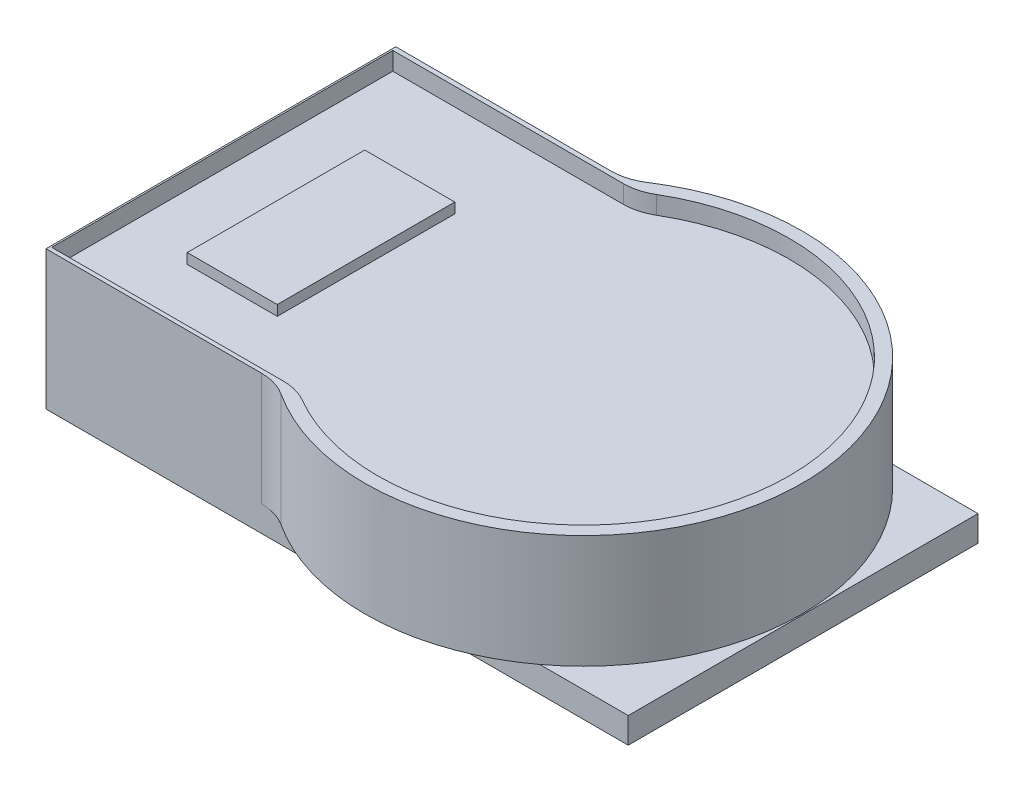
ISO-10303-21;
HEADER;
FILE_DESCRIPTION(('STEP AP214'),'2;1');
FILE_NAME('part.step','',(''),(''),'','','');
FILE_SCHEMA(('AUTOMOTIVE_DESIGN { 1 0 10303 214 1 1 1 1 }'));
ENDSEC;
DATA;
#1=APPLICATION_CONTEXT('core data for automotive mechanical design processes');
#2=APPLICATION_PROTOCOL_DEFINITION('international standard','automotive_design',2000,#1);
#3=PRODUCT_CONTEXT('',#1,'mechanical');
#4=PRODUCT('Part','Part','',(#3));
#5=PRODUCT_RELATED_PRODUCT_CATEGORY('part','',(#4));
#6=PRODUCT_DEFINITION_FORMATION('','',#4);
#7=PRODUCT_DEFINITION_CONTEXT('part definition',#1,'design');
#8=PRODUCT_DEFINITION('design','',#6,#7);
#9=PRODUCT_DEFINITION_SHAPE('','',#8);
#10=(LENGTH_UNIT() NAMED_UNIT(*) SI_UNIT(.MILLI.,.METRE.));
#11=(NAMED_UNIT(*) PLANE_ANGLE_UNIT() SI_UNIT($,.RADIAN.));
#12=(NAMED_UNIT(*) SI_UNIT($,.STERADIAN.) SOLID_ANGLE_UNIT());
#13=UNCERTAINTY_MEASURE_WITH_UNIT(LENGTH_MEASURE(1.E-05),#10,'distance_accuracy_value','');
#14=(GEOMETRIC_REPRESENTATION_CONTEXT(3) GLOBAL_UNCERTAINTY_ASSIGNED_CONTEXT((#13)) GLOBAL_UNIT_ASSIGNED_CONTEXT((#10,
#11,#12)) REPRESENTATION_CONTEXT('',''));
#15=CARTESIAN_POINT('',(0.,0.,0.));
#16=DIRECTION('',(0.,0.,1.));
#17=DIRECTION('',(1.,0.,0.));
#18=AXIS2_PLACEMENT_3D('',#15,#16,#17);
#19=CARTESIAN_POINT('',(0.,0.,0.));
#20=DIRECTION('',(0.,1.,0.));
#21=DIRECTION('',(0.,0.,1.));
#22=AXIS2_PLACEMENT_3D('',#19,#20,#21);
#23=PLANE('',#22);
#24=DIRECTION('',(-1.,0.,0.));
#25=VECTOR('',#24,1.);
#26=CARTESIAN_POINT('',(-70.5,0.,34.));
#27=LINE('',#26,#25);
#28=CARTESIAN_POINT('',(25.5,0.,34.));
#29=VERTEX_POINT('',#28);
#30=CARTESIAN_POINT('',(-28.6400069832394,0.,34.));
#31=VERTEX_POINT('',#30);
#32=EDGE_CURVE('E11',#29,#31,#27,.T.);
#33=ORIENTED_EDGE('',*,*,#32,.F.);
#34=CARTESIAN_POINT('',(0.,0.,0.));
#35=DIRECTION('',(0.,1.,0.));
#36=DIRECTION('',(0.,0.,1.));
#37=AXIS2_PLACEMENT_3D('',#34,#35,#36);
#38=CIRCLE('',#37,42.5);
#39=CARTESIAN_POINT('',(-23.1847675578605,0.,35.6190476190476));
#40=VERTEX_POINT('',#39);
#41=EDGE_CURVE('E272',#40,#29,#38,.T.);
#42=ORIENTED_EDGE('',*,*,#41,.F.);
#43=CARTESIAN_POINT('',(-28.6400069832394,0.,44.));
#44=DIRECTION('',(0.,1.,0.));
#45=DIRECTION('',(0.,0.,1.));
#46=AXIS2_PLACEMENT_3D('',#43,#44,#45);
#47=CIRCLE('',#46,10.);
#48=EDGE_CURVE('E297',#40,#31,#47,.T.);
#49=ORIENTED_EDGE('',*,*,#48,.T.);
#50=EDGE_LOOP('',(#33,#42,#49));
#51=FACE_BOUND('',#50,.T.);
#52=ADVANCED_FACE('F41',(#51),#23,.F.);
#53=DIRECTION('',(1.,0.,0.));
#54=VECTOR('',#53,1.);
#55=CARTESIAN_POINT('',(-70.5,0.,-34.));
#56=LINE('',#55,#54);
#57=CARTESIAN_POINT('',(-28.6400069832394,0.,-34.));
#58=VERTEX_POINT('',#57);
#59=CARTESIAN_POINT('',(25.5,0.,-34.));
#60=VERTEX_POINT('',#59);
#61=EDGE_CURVE('E50',#58,#60,#56,.T.);
#62=ORIENTED_EDGE('',*,*,#61,.F.);
#63=CARTESIAN_POINT('',(-28.6400069832394,0.,-44.));
#64=DIRECTION('',(0.,1.,0.));
#65=DIRECTION('',(0.,0.,1.));
#66=AXIS2_PLACEMENT_3D('',#63,#64,#65);
#67=CIRCLE('',#66,10.);
#68=CARTESIAN_POINT('',(-23.1847675578605,0.,-35.6190476190476));
#69=VERTEX_POINT('',#68);
#70=EDGE_CURVE('E292',#58,#69,#67,.T.);
#71=ORIENTED_EDGE('',*,*,#70,.T.);
#72=EDGE_CURVE('E267',#60,#69,#38,.T.);
#73=ORIENTED_EDGE('',*,*,#72,.F.);
#74=EDGE_LOOP('',(#62,#71,#73));
#75=FACE_BOUND('',#74,.T.);
#76=ADVANCED_FACE('F326',(#75),#23,.F.);
#77=CARTESIAN_POINT('',(0.,18.5,0.));
#78=DIRECTION('',(0.,1.,0.));
#79=DIRECTION('',(0.,0.,1.));
#80=AXIS2_PLACEMENT_3D('',#77,#78,#79);
#81=PLANE('',#80);
#82=DIRECTION('',(1.,0.,0.));
#83=VECTOR('',#82,1.);
#84=CARTESIAN_POINT('',(-22.2892821551774,18.5,33.2142725497171));
#85=LINE('',#84,#83);
#86=CARTESIAN_POINT('',(-70.1756429433828,18.5,33.2142725497171));
#87=VERTEX_POINT('',#86);
#88=CARTESIAN_POINT('',(-25.1500824650491,18.5,33.2142725497171));
#89=VERTEX_POINT('',#88);
#90=EDGE_CURVE('E252',#87,#89,#85,.T.);
#91=ORIENTED_EDGE('',*,*,#90,.T.);
#92=CARTESIAN_POINT('',(-25.1500824650491,18.5,43.2142725497171));
#93=DIRECTION('',(0.,1.,0.));
#94=DIRECTION('',(0.,0.,1.));
#95=AXIS2_PLACEMENT_3D('',#92,#93,#94);
#96=CIRCLE('',#95,10.);
#97=CARTESIAN_POINT('',(-20.1200659720393,18.5,34.5714180397736));
#98=VERTEX_POINT('',#97);
#99=EDGE_CURVE('E314',#89,#98,#96,.F.);
#100=ORIENTED_EDGE('',*,*,#99,.T.);
#101=CARTESIAN_POINT('',(0.,18.5,0.));
#102=DIRECTION('',(0.,1.,0.));
#103=DIRECTION('',(0.,0.,1.));
#104=AXIS2_PLACEMENT_3D('',#101,#102,#103);
#105=CIRCLE('',#104,40.);
#106=CARTESIAN_POINT('',(-20.2885309580401,18.5,-34.4728227965835));
#107=VERTEX_POINT('',#106);
#108=EDGE_CURVE('E243',#98,#107,#105,.T.);
#109=ORIENTED_EDGE('',*,*,#108,.T.);
#110=CARTESIAN_POINT('',(-25.3606636975501,18.5,-43.0910284957294));
#111=DIRECTION('',(0.,1.,0.));
#112=DIRECTION('',(0.,0.,1.));
#113=AXIS2_PLACEMENT_3D('',#110,#111,#112);
#114=CIRCLE('',#113,10.);
#115=CARTESIAN_POINT('',(-25.3606636975501,18.5,-33.0910284957294));
#116=VERTEX_POINT('',#115);
#117=EDGE_CURVE('E45',#107,#116,#114,.F.);
#118=ORIENTED_EDGE('',*,*,#117,.T.);
#119=DIRECTION('',(-1.,0.,0.));
#120=VECTOR('',#119,1.);
#121=CARTESIAN_POINT('',(-22.4718453424462,18.5,-33.0910284957294));
#122=LINE('',#121,#120);
#123=CARTESIAN_POINT('',(-70.1756429433829,18.5,-33.0910284957294));
#124=VERTEX_POINT('',#123);
#125=EDGE_CURVE('E246',#116,#124,#122,.T.);
#126=ORIENTED_EDGE('',*,*,#125,.T.);
#127=DIRECTION('',(0.,0.,1.));
#128=VECTOR('',#127,1.);
#129=CARTESIAN_POINT('',(-70.1756429433829,18.5,-33.0910284957294));
#130=LINE('',#129,#128);
#131=EDGE_CURVE('E249',#124,#87,#130,.T.);
#132=ORIENTED_EDGE('',*,*,#131,.T.);
#133=EDGE_LOOP('',(#91,#100,#109,#118,#126,#132));
#134=FACE_BOUND('',#133,.T.);
#135=DIRECTION('',(1.,0.,0.));
#136=VECTOR('',#135,1.);
#137=CARTESIAN_POINT('',(-57.6283951116879,18.5,19.4109385030815));
#138=LINE('',#137,#136);
#139=CARTESIAN_POINT('',(-57.6283951116879,18.5,19.4109385030815));
#140=VERTEX_POINT('',#139);
#141=CARTESIAN_POINT('',(-40.1277394454176,18.5,19.4109385030815));
#142=VERTEX_POINT('',#141);
#143=EDGE_CURVE('E229',#140,#142,#138,.T.);
#144=ORIENTED_EDGE('',*,*,#143,.F.);
#145=DIRECTION('',(0.,0.,1.));
#146=VECTOR('',#145,1.);
#147=CARTESIAN_POINT('',(-57.6283951116879,18.5,-15.0973966135078));
#148=LINE('',#147,#146);
#149=CARTESIAN_POINT('',(-57.6283951116879,18.5,-15.0973966135078));
#150=VERTEX_POINT('',#149);
#151=EDGE_CURVE('E215',#150,#140,#148,.T.);
#152=ORIENTED_EDGE('',*,*,#151,.F.);
#153=DIRECTION('',(-1.,0.,0.));
#154=VECTOR('',#153,1.);
#155=CARTESIAN_POINT('',(-57.6283951116879,18.5,-15.0973966135078));
#156=LINE('',#155,#154);
#157=CARTESIAN_POINT('',(-40.1277394454176,18.5,-15.0973966135078));
#158=VERTEX_POINT('',#157);
#159=EDGE_CURVE('E220',#158,#150,#156,.T.);
#160=ORIENTED_EDGE('',*,*,#159,.F.);
#161=DIRECTION('',(0.,0.,-1.));
#162=VECTOR('',#161,1.);
#163=CARTESIAN_POINT('',(-40.1277394454176,18.5,-15.0973966135078));
#164=LINE('',#163,#162);
#165=EDGE_CURVE('E231',#142,#158,#164,.T.);
#166=ORIENTED_EDGE('',*,*,#165,.F.);
#167=EDGE_LOOP('',(#144,#152,#160,#166));
#168=FACE_BOUND('',#167,.T.);
#169=ADVANCED_FACE('F347',(#134,#168),#81,.T.);
#170=CARTESIAN_POINT('',(-70.5,22.,-34.));
#171=DIRECTION('',(1.,0.,0.));
#172=DIRECTION('',(0.,0.,-1.));
#173=AXIS2_PLACEMENT_3D('',#170,#171,#172);
#174=PLANE('',#173);
#175=DIRECTION('',(0.,-1.,0.));
#176=VECTOR('',#175,1.);
#177=CARTESIAN_POINT('',(-70.5,22.,-34.));
#178=LINE('',#177,#176);
#179=CARTESIAN_POINT('',(-70.5,22.,-34.));
#180=VERTEX_POINT('',#179);
#181=CARTESIAN_POINT('',(-70.5,-5.,-34.));
#182=VERTEX_POINT('',#181);
#183=EDGE_CURVE('E176',#180,#182,#178,.T.);
#184=ORIENTED_EDGE('',*,*,#183,.T.);
#185=DIRECTION('',(0.,0.,-1.));
#186=VECTOR('',#185,1.);
#187=CARTESIAN_POINT('',(-70.5,-5.,34.));
#188=LINE('',#187,#186);
#189=CARTESIAN_POINT('',(-70.5,-5.,34.));
#190=VERTEX_POINT('',#189);
#191=EDGE_CURVE('E181',#190,#182,#188,.T.);
#192=ORIENTED_EDGE('',*,*,#191,.F.);
#193=DIRECTION('',(0.,-1.,0.));
#194=VECTOR('',#193,1.);
#195=CARTESIAN_POINT('',(-70.5,22.,34.));
#196=LINE('',#195,#194);
#197=CARTESIAN_POINT('',(-70.5,22.,34.));
#198=VERTEX_POINT('',#197);
#199=EDGE_CURVE('E186',#198,#190,#196,.T.);
#200=ORIENTED_EDGE('',*,*,#199,.F.);
#201=DIRECTION('',(0.,0.,1.));
#202=VECTOR('',#201,1.);
#203=CARTESIAN_POINT('',(-70.5,22.,-34.));
#204=LINE('',#203,#202);
#205=EDGE_CURVE('E183',#180,#198,#204,.T.);
#206=ORIENTED_EDGE('',*,*,#205,.F.);
#207=EDGE_LOOP('',(#184,#192,#200,#206));
#208=FACE_BOUND('',#207,.T.);
#209=ADVANCED_FACE('F178',(#208),#174,.F.);
#210=CARTESIAN_POINT('',(-70.5,22.,34.));
#211=DIRECTION('',(0.,0.,-1.));
#212=DIRECTION('',(-1.,0.,0.));
#213=AXIS2_PLACEMENT_3D('',#210,#211,#212);
#214=PLANE('',#213);
#215=ORIENTED_EDGE('',*,*,#199,.T.);
#216=DIRECTION('',(-1.,0.,0.));
#217=VECTOR('',#216,1.);
#218=CARTESIAN_POINT('',(-70.5,-5.,34.));
#219=LINE('',#218,#217);
#220=CARTESIAN_POINT('',(42.6922648343967,-5.,34.));
#221=VERTEX_POINT('',#220);
#222=EDGE_CURVE('E201',#221,#190,#219,.T.);
#223=ORIENTED_EDGE('',*,*,#222,.F.);
#224=DIRECTION('',(0.,1.,0.));
#225=VECTOR('',#224,1.);
#226=CARTESIAN_POINT('',(42.6922648343967,-5.,34.));
#227=LINE('',#226,#225);
#228=CARTESIAN_POINT('',(42.6922648343967,0.,34.));
#229=VERTEX_POINT('',#228);
#230=EDGE_CURVE('E208',#221,#229,#227,.T.);
#231=ORIENTED_EDGE('',*,*,#230,.T.);
#232=EDGE_CURVE('E52',#229,#29,#27,.T.);
#233=ORIENTED_EDGE('',*,*,#232,.T.);
#234=ORIENTED_EDGE('',*,*,#32,.T.);
#235=DIRECTION('',(0.,1.,0.));
#236=VECTOR('',#235,1.);
#237=CARTESIAN_POINT('',(-28.6400069832394,22.,34.));
#238=LINE('',#237,#236);
#239=CARTESIAN_POINT('',(-28.6400069832394,22.,34.));
#240=VERTEX_POINT('',#239);
#241=EDGE_CURVE('E290',#31,#240,#238,.T.);
#242=ORIENTED_EDGE('',*,*,#241,.T.);
#243=DIRECTION('',(1.,0.,0.));
#244=VECTOR('',#243,1.);
#245=CARTESIAN_POINT('',(-70.5,22.,34.));
#246=LINE('',#245,#244);
#247=EDGE_CURVE('E271',#198,#240,#246,.T.);
#248=ORIENTED_EDGE('',*,*,#247,.F.);
#249=EDGE_LOOP('',(#215,#223,#231,#233,#234,#242,#248));
#250=FACE_BOUND('',#249,.T.);
#251=ADVANCED_FACE('F355',(#250),#214,.F.);
#252=CARTESIAN_POINT('',(0.,22.,0.));
#253=DIRECTION('',(0.,-1.,0.));
#254=DIRECTION('',(0.,0.,-1.));
#255=AXIS2_PLACEMENT_3D('',#252,#253,#254);
#256=CYLINDRICAL_SURFACE('',#255,42.5);
#257=ORIENTED_EDGE('',*,*,#41,.T.);
#258=EDGE_CURVE('E279',#29,#60,#38,.T.);
#259=ORIENTED_EDGE('',*,*,#258,.T.);
#260=ORIENTED_EDGE('',*,*,#72,.T.);
#261=DIRECTION('',(0.,-1.,0.));
#262=VECTOR('',#261,1.);
#263=CARTESIAN_POINT('',(-23.1847675578605,22.,-35.6190476190476));
#264=LINE('',#263,#262);
#265=CARTESIAN_POINT('',(-23.1847675578605,22.,-35.6190476190476));
#266=VERTEX_POINT('',#265);
#267=EDGE_CURVE('E288',#69,#266,#264,.F.);
#268=ORIENTED_EDGE('',*,*,#267,.T.);
#269=CARTESIAN_POINT('',(0.,22.,0.));
#270=DIRECTION('',(0.,1.,0.));
#271=DIRECTION('',(0.,0.,1.));
#272=AXIS2_PLACEMENT_3D('',#269,#270,#271);
#273=CIRCLE('',#272,42.5);
#274=CARTESIAN_POINT('',(-23.1847675578605,22.,35.6190476190476));
#275=VERTEX_POINT('',#274);
#276=EDGE_CURVE('E275',#275,#266,#273,.T.);
#277=ORIENTED_EDGE('',*,*,#276,.F.);
#278=DIRECTION('',(0.,-1.,0.));
#279=VECTOR('',#278,1.);
#280=CARTESIAN_POINT('',(-23.1847675578605,22.,35.6190476190476));
#281=LINE('',#280,#279);
#282=EDGE_CURVE('E285',#275,#40,#281,.T.);
#283=ORIENTED_EDGE('',*,*,#282,.T.);
#284=EDGE_LOOP('',(#257,#259,#260,#268,#277,#283));
#285=FACE_BOUND('',#284,.T.);
#286=ADVANCED_FACE('F333',(#285),#256,.T.);
#287=CARTESIAN_POINT('',(-70.5,22.,-34.));
#288=DIRECTION('',(0.,0.,1.));
#289=DIRECTION('',(1.,0.,0.));
#290=AXIS2_PLACEMENT_3D('',#287,#288,#289);
#291=PLANE('',#290);
#292=DIRECTION('',(-1.,0.,0.));
#293=VECTOR('',#292,1.);
#294=CARTESIAN_POINT('',(-70.5,22.,-34.));
#295=LINE('',#294,#293);
#296=CARTESIAN_POINT('',(-28.6400069832394,22.,-34.));
#297=VERTEX_POINT('',#296);
#298=EDGE_CURVE('E187',#297,#180,#295,.T.);
#299=ORIENTED_EDGE('',*,*,#298,.F.);
#300=DIRECTION('',(0.,1.,0.));
#301=VECTOR('',#300,1.);
#302=CARTESIAN_POINT('',(-28.6400069832394,0.,-34.));
#303=LINE('',#302,#301);
#304=EDGE_CURVE('E282',#297,#58,#303,.F.);
#305=ORIENTED_EDGE('',*,*,#304,.T.);
#306=ORIENTED_EDGE('',*,*,#61,.T.);
#307=CARTESIAN_POINT('',(42.6922648343967,0.,-34.));
#308=VERTEX_POINT('',#307);
#309=EDGE_CURVE('E209',#60,#308,#56,.T.);
#310=ORIENTED_EDGE('',*,*,#309,.T.);
#311=DIRECTION('',(0.,1.,0.));
#312=VECTOR('',#311,1.);
#313=CARTESIAN_POINT('',(42.6922648343967,-5.,-34.));
#314=LINE('',#313,#312);
#315=CARTESIAN_POINT('',(42.6922648343967,-5.,-34.));
#316=VERTEX_POINT('',#315);
#317=EDGE_CURVE('E193',#316,#308,#314,.T.);
#318=ORIENTED_EDGE('',*,*,#317,.F.);
#319=DIRECTION('',(1.,0.,0.));
#320=VECTOR('',#319,1.);
#321=CARTESIAN_POINT('',(-70.5,-5.,-34.));
#322=LINE('',#321,#320);
#323=EDGE_CURVE('E190',#182,#316,#322,.T.);
#324=ORIENTED_EDGE('',*,*,#323,.F.);
#325=ORIENTED_EDGE('',*,*,#183,.F.);
#326=EDGE_LOOP('',(#299,#305,#306,#310,#318,#324,#325));
#327=FACE_BOUND('',#326,.T.);
#328=ADVANCED_FACE('F191',(#327),#291,.F.);
#329=CARTESIAN_POINT('',(0.,22.,0.));
#330=DIRECTION('',(0.,1.,0.));
#331=DIRECTION('',(0.,0.,1.));
#332=AXIS2_PLACEMENT_3D('',#329,#330,#331);
#333=PLANE('',#332);
#334=CARTESIAN_POINT('',(0.,22.,0.));
#335=DIRECTION('',(0.,1.,0.));
#336=DIRECTION('',(0.,0.,1.));
#337=AXIS2_PLACEMENT_3D('',#334,#335,#336);
#338=CIRCLE('',#337,40.);
#339=CARTESIAN_POINT('',(-20.1200659720393,22.,34.5714180397736));
#340=VERTEX_POINT('',#339);
#341=CARTESIAN_POINT('',(-20.2885309580401,22.,-34.4728227965835));
#342=VERTEX_POINT('',#341);
#343=EDGE_CURVE('E242',#340,#342,#338,.T.);
#344=ORIENTED_EDGE('',*,*,#343,.F.);
#345=CARTESIAN_POINT('',(-25.1500824650491,22.,43.2142725497171));
#346=DIRECTION('',(0.,1.,0.));
#347=DIRECTION('',(0.,0.,1.));
#348=AXIS2_PLACEMENT_3D('',#345,#346,#347);
#349=CIRCLE('',#348,10.);
#350=CARTESIAN_POINT('',(-25.1500824650491,22.,33.2142725497171));
#351=VERTEX_POINT('',#350);
#352=EDGE_CURVE('E308',#340,#351,#349,.T.);
#353=ORIENTED_EDGE('',*,*,#352,.T.);
#354=DIRECTION('',(1.,0.,0.));
#355=VECTOR('',#354,1.);
#356=CARTESIAN_POINT('',(-22.2892821551774,22.,33.2142725497171));
#357=LINE('',#356,#355);
#358=CARTESIAN_POINT('',(-70.1756429433828,22.,33.2142725497171));
#359=VERTEX_POINT('',#358);
#360=EDGE_CURVE('E247',#359,#351,#357,.T.);
#361=ORIENTED_EDGE('',*,*,#360,.F.);
#362=DIRECTION('',(0.,0.,1.));
#363=VECTOR('',#362,1.);
#364=CARTESIAN_POINT('',(-70.1756429433829,22.,-33.0910284957294));
#365=LINE('',#364,#363);
#366=CARTESIAN_POINT('',(-70.1756429433829,22.,-33.0910284957294));
#367=VERTEX_POINT('',#366);
#368=EDGE_CURVE('E260',#367,#359,#365,.T.);
#369=ORIENTED_EDGE('',*,*,#368,.F.);
#370=DIRECTION('',(-1.,0.,0.));
#371=VECTOR('',#370,1.);
#372=CARTESIAN_POINT('',(-22.4718453424462,22.,-33.0910284957294));
#373=LINE('',#372,#371);
#374=CARTESIAN_POINT('',(-25.3606636975501,22.,-33.0910284957294));
#375=VERTEX_POINT('',#374);
#376=EDGE_CURVE('E258',#375,#367,#373,.T.);
#377=ORIENTED_EDGE('',*,*,#376,.F.);
#378=CARTESIAN_POINT('',(-25.3606636975501,22.,-43.0910284957294));
#379=DIRECTION('',(0.,1.,0.));
#380=DIRECTION('',(0.,0.,1.));
#381=AXIS2_PLACEMENT_3D('',#378,#379,#380);
#382=CIRCLE('',#381,10.);
#383=EDGE_CURVE('E306',#375,#342,#382,.T.);
#384=ORIENTED_EDGE('',*,*,#383,.T.);
#385=EDGE_LOOP('',(#344,#353,#361,#369,#377,#384));
#386=FACE_BOUND('',#385,.T.);
#387=ORIENTED_EDGE('',*,*,#205,.T.);
#388=ORIENTED_EDGE('',*,*,#247,.T.);
#389=CARTESIAN_POINT('',(-28.6400069832394,22.,44.));
#390=DIRECTION('',(0.,1.,0.));
#391=DIRECTION('',(0.,0.,1.));
#392=AXIS2_PLACEMENT_3D('',#389,#390,#391);
#393=CIRCLE('',#392,10.);
#394=EDGE_CURVE('E299',#240,#275,#393,.F.);
#395=ORIENTED_EDGE('',*,*,#394,.T.);
#396=ORIENTED_EDGE('',*,*,#276,.T.);
#397=CARTESIAN_POINT('',(-28.6400069832394,22.,-44.));
#398=DIRECTION('',(0.,1.,0.));
#399=DIRECTION('',(0.,0.,1.));
#400=AXIS2_PLACEMENT_3D('',#397,#398,#399);
#401=CIRCLE('',#400,10.);
#402=EDGE_CURVE('E295',#266,#297,#401,.F.);
#403=ORIENTED_EDGE('',*,*,#402,.T.);
#404=ORIENTED_EDGE('',*,*,#298,.T.);
#405=EDGE_LOOP('',(#387,#388,#395,#396,#403,#404));
#406=FACE_BOUND('',#405,.T.);
#407=ADVANCED_FACE('F336',(#386,#406),#333,.T.);
#408=CARTESIAN_POINT('',(-28.6400069832394,22.,-44.));
#409=DIRECTION('',(0.,-1.,0.));
#410=DIRECTION('',(0.,0.,-1.));
#411=AXIS2_PLACEMENT_3D('',#408,#409,#410);
#412=CYLINDRICAL_SURFACE('',#411,10.);
#413=ORIENTED_EDGE('',*,*,#402,.F.);
#414=ORIENTED_EDGE('',*,*,#267,.F.);
#415=ORIENTED_EDGE('',*,*,#70,.F.);
#416=ORIENTED_EDGE('',*,*,#304,.F.);
#417=EDGE_LOOP('',(#413,#414,#415,#416));
#418=FACE_BOUND('',#417,.T.);
#419=ADVANCED_FACE('F330',(#418),#412,.F.);
#420=CARTESIAN_POINT('',(-28.6400069832394,22.,44.));
#421=DIRECTION('',(0.,-1.,0.));
#422=DIRECTION('',(0.,0.,-1.));
#423=AXIS2_PLACEMENT_3D('',#420,#421,#422);
#424=CYLINDRICAL_SURFACE('',#423,10.);
#425=ORIENTED_EDGE('',*,*,#394,.F.);
#426=ORIENTED_EDGE('',*,*,#241,.F.);
#427=ORIENTED_EDGE('',*,*,#48,.F.);
#428=ORIENTED_EDGE('',*,*,#282,.F.);
#429=EDGE_LOOP('',(#425,#426,#427,#428));
#430=FACE_BOUND('',#429,.T.);
#431=ADVANCED_FACE('F340',(#430),#424,.F.);
#432=CARTESIAN_POINT('',(0.,18.5,0.));
#433=DIRECTION('',(0.,1.,0.));
#434=DIRECTION('',(0.,0.,1.));
#435=AXIS2_PLACEMENT_3D('',#432,#433,#434);
#436=CYLINDRICAL_SURFACE('',#435,40.);
#437=ORIENTED_EDGE('',*,*,#108,.F.);
#438=DIRECTION('',(0.,1.,0.));
#439=VECTOR('',#438,1.);
#440=CARTESIAN_POINT('',(-20.1200659720393,18.5,34.5714180397736));
#441=LINE('',#440,#439);
#442=EDGE_CURVE('E303',#98,#340,#441,.T.);
#443=ORIENTED_EDGE('',*,*,#442,.T.);
#444=ORIENTED_EDGE('',*,*,#343,.T.);
#445=DIRECTION('',(0.,1.,0.));
#446=VECTOR('',#445,1.);
#447=CARTESIAN_POINT('',(-20.2885309580401,18.5,-34.4728227965835));
#448=LINE('',#447,#446);
#449=EDGE_CURVE('E301',#342,#107,#448,.F.);
#450=ORIENTED_EDGE('',*,*,#449,.T.);
#451=EDGE_LOOP('',(#437,#443,#444,#450));
#452=FACE_BOUND('',#451,.T.);
#453=ADVANCED_FACE('F364',(#452),#436,.F.);
#454=CARTESIAN_POINT('',(-22.2892821551774,18.5,33.2142725497171));
#455=DIRECTION('',(0.,0.,1.));
#456=DIRECTION('',(1.,0.,0.));
#457=AXIS2_PLACEMENT_3D('',#454,#455,#456);
#458=PLANE('',#457);
#459=ORIENTED_EDGE('',*,*,#360,.T.);
#460=DIRECTION('',(0.,1.,0.));
#461=VECTOR('',#460,1.);
#462=CARTESIAN_POINT('',(-25.1500824650491,18.5,33.2142725497171));
#463=LINE('',#462,#461);
#464=EDGE_CURVE('E310',#351,#89,#463,.F.);
#465=ORIENTED_EDGE('',*,*,#464,.T.);
#466=ORIENTED_EDGE('',*,*,#90,.F.);
#467=DIRECTION('',(0.,1.,0.));
#468=VECTOR('',#467,1.);
#469=CARTESIAN_POINT('',(-70.1756429433828,18.5,33.2142725497171));
#470=LINE('',#469,#468);
#471=EDGE_CURVE('E265',#87,#359,#470,.T.);
#472=ORIENTED_EDGE('',*,*,#471,.T.);
#473=EDGE_LOOP('',(#459,#465,#466,#472));
#474=FACE_BOUND('',#473,.T.);
#475=ADVANCED_FACE('F394',(#474),#458,.F.);
#476=CARTESIAN_POINT('',(-70.1756429433829,18.5,-33.0910284957294));
#477=DIRECTION('',(-1.,0.,0.));
#478=DIRECTION('',(0.,0.,1.));
#479=AXIS2_PLACEMENT_3D('',#476,#477,#478);
#480=PLANE('',#479);
#481=ORIENTED_EDGE('',*,*,#368,.T.);
#482=ORIENTED_EDGE('',*,*,#471,.F.);
#483=ORIENTED_EDGE('',*,*,#131,.F.);
#484=DIRECTION('',(0.,1.,0.));
#485=VECTOR('',#484,1.);
#486=CARTESIAN_POINT('',(-70.1756429433829,18.5,-33.0910284957294));
#487=LINE('',#486,#485);
#488=EDGE_CURVE('E255',#124,#367,#487,.T.);
#489=ORIENTED_EDGE('',*,*,#488,.T.);
#490=EDGE_LOOP('',(#481,#482,#483,#489));
#491=FACE_BOUND('',#490,.T.);
#492=ADVANCED_FACE('F375',(#491),#480,.F.);
#493=CARTESIAN_POINT('',(-22.4718453424462,18.5,-33.0910284957294));
#494=DIRECTION('',(0.,0.,-1.));
#495=DIRECTION('',(-1.,0.,0.));
#496=AXIS2_PLACEMENT_3D('',#493,#494,#495);
#497=PLANE('',#496);
#498=ORIENTED_EDGE('',*,*,#125,.F.);
#499=DIRECTION('',(0.,1.,0.));
#500=VECTOR('',#499,1.);
#501=CARTESIAN_POINT('',(-25.3606636975501,18.5,-33.0910284957294));
#502=LINE('',#501,#500);
#503=EDGE_CURVE('E312',#116,#375,#502,.T.);
#504=ORIENTED_EDGE('',*,*,#503,.T.);
#505=ORIENTED_EDGE('',*,*,#376,.T.);
#506=ORIENTED_EDGE('',*,*,#488,.F.);
#507=EDGE_LOOP('',(#498,#504,#505,#506));
#508=FACE_BOUND('',#507,.T.);
#509=ADVANCED_FACE('F367',(#508),#497,.F.);
#510=CARTESIAN_POINT('',(-25.1500824650491,18.5,43.2142725497171));
#511=DIRECTION('',(0.,1.,0.));
#512=DIRECTION('',(0.,0.,1.));
#513=AXIS2_PLACEMENT_3D('',#510,#511,#512);
#514=CYLINDRICAL_SURFACE('',#513,10.);
#515=ORIENTED_EDGE('',*,*,#99,.F.);
#516=ORIENTED_EDGE('',*,*,#464,.F.);
#517=ORIENTED_EDGE('',*,*,#352,.F.);
#518=ORIENTED_EDGE('',*,*,#442,.F.);
#519=EDGE_LOOP('',(#515,#516,#517,#518));
#520=FACE_BOUND('',#519,.T.);
#521=ADVANCED_FACE('F365',(#520),#514,.T.);
#522=CARTESIAN_POINT('',(-25.3606636975501,18.5,-43.0910284957294));
#523=DIRECTION('',(0.,1.,0.));
#524=DIRECTION('',(0.,0.,1.));
#525=AXIS2_PLACEMENT_3D('',#522,#523,#524);
#526=CYLINDRICAL_SURFACE('',#525,10.);
#527=ORIENTED_EDGE('',*,*,#117,.F.);
#528=ORIENTED_EDGE('',*,*,#449,.F.);
#529=ORIENTED_EDGE('',*,*,#383,.F.);
#530=ORIENTED_EDGE('',*,*,#503,.F.);
#531=EDGE_LOOP('',(#527,#528,#529,#530));
#532=FACE_BOUND('',#531,.T.);
#533=ADVANCED_FACE('F43',(#532),#526,.T.);
#534=CARTESIAN_POINT('',(-57.6283951116879,20.5,-15.0973966135078));
#535=DIRECTION('',(1.,0.,0.));
#536=DIRECTION('',(0.,0.,-1.));
#537=AXIS2_PLACEMENT_3D('',#534,#535,#536);
#538=PLANE('',#537);
#539=ORIENTED_EDGE('',*,*,#151,.T.);
#540=DIRECTION('',(0.,-1.,0.));
#541=VECTOR('',#540,1.);
#542=CARTESIAN_POINT('',(-57.6283951116879,20.5,19.4109385030815));
#543=LINE('',#542,#541);
#544=CARTESIAN_POINT('',(-57.6283951116879,20.5,19.4109385030815));
#545=VERTEX_POINT('',#544);
#546=EDGE_CURVE('E240',#545,#140,#543,.T.);
#547=ORIENTED_EDGE('',*,*,#546,.F.);
#548=DIRECTION('',(0.,0.,1.));
#549=VECTOR('',#548,1.);
#550=CARTESIAN_POINT('',(-57.6283951116879,20.5,-15.0973966135078));
#551=LINE('',#550,#549);
#552=CARTESIAN_POINT('',(-57.6283951116879,20.5,-15.0973966135078));
#553=VERTEX_POINT('',#552);
#554=EDGE_CURVE('E216',#553,#545,#551,.T.);
#555=ORIENTED_EDGE('',*,*,#554,.F.);
#556=DIRECTION('',(0.,-1.,0.));
#557=VECTOR('',#556,1.);
#558=CARTESIAN_POINT('',(-57.6283951116879,20.5,-15.0973966135078));
#559=LINE('',#558,#557);
#560=EDGE_CURVE('E226',#553,#150,#559,.T.);
#561=ORIENTED_EDGE('',*,*,#560,.T.);
#562=EDGE_LOOP('',(#539,#547,#555,#561));
#563=FACE_BOUND('',#562,.T.);
#564=ADVANCED_FACE('F373',(#563),#538,.F.);
#565=CARTESIAN_POINT('',(-57.6283951116879,20.5,19.4109385030815));
#566=DIRECTION('',(0.,0.,-1.));
#567=DIRECTION('',(-1.,0.,0.));
#568=AXIS2_PLACEMENT_3D('',#565,#566,#567);
#569=PLANE('',#568);
#570=ORIENTED_EDGE('',*,*,#143,.T.);
#571=DIRECTION('',(0.,-1.,0.));
#572=VECTOR('',#571,1.);
#573=CARTESIAN_POINT('',(-40.1277394454176,20.5,19.4109385030815));
#574=LINE('',#573,#572);
#575=CARTESIAN_POINT('',(-40.1277394454176,20.5,19.4109385030815));
#576=VERTEX_POINT('',#575);
#577=EDGE_CURVE('E237',#576,#142,#574,.T.);
#578=ORIENTED_EDGE('',*,*,#577,.F.);
#579=DIRECTION('',(1.,0.,0.));
#580=VECTOR('',#579,1.);
#581=CARTESIAN_POINT('',(-57.6283951116879,20.5,19.4109385030815));
#582=LINE('',#581,#580);
#583=EDGE_CURVE('E219',#545,#576,#582,.T.);
#584=ORIENTED_EDGE('',*,*,#583,.F.);
#585=ORIENTED_EDGE('',*,*,#546,.T.);
#586=EDGE_LOOP('',(#570,#578,#584,#585));
#587=FACE_BOUND('',#586,.T.);
#588=ADVANCED_FACE('F445',(#587),#569,.F.);
#589=CARTESIAN_POINT('',(-40.1277394454176,20.5,-15.0973966135078));
#590=DIRECTION('',(-1.,0.,0.));
#591=DIRECTION('',(0.,0.,1.));
#592=AXIS2_PLACEMENT_3D('',#589,#590,#591);
#593=PLANE('',#592);
#594=ORIENTED_EDGE('',*,*,#165,.T.);
#595=DIRECTION('',(0.,-1.,0.));
#596=VECTOR('',#595,1.);
#597=CARTESIAN_POINT('',(-40.1277394454176,20.5,-15.0973966135078));
#598=LINE('',#597,#596);
#599=CARTESIAN_POINT('',(-40.1277394454176,20.5,-15.0973966135078));
#600=VERTEX_POINT('',#599);
#601=EDGE_CURVE('E65',#600,#158,#598,.T.);
#602=ORIENTED_EDGE('',*,*,#601,.F.);
#603=DIRECTION('',(0.,0.,-1.));
#604=VECTOR('',#603,1.);
#605=CARTESIAN_POINT('',(-40.1277394454176,20.5,-15.0973966135078));
#606=LINE('',#605,#604);
#607=EDGE_CURVE('E222',#576,#600,#606,.T.);
#608=ORIENTED_EDGE('',*,*,#607,.F.);
#609=ORIENTED_EDGE('',*,*,#577,.T.);
#610=EDGE_LOOP('',(#594,#602,#608,#609));
#611=FACE_BOUND('',#610,.T.);
#612=ADVANCED_FACE('F455',(#611),#593,.F.);
#613=CARTESIAN_POINT('',(-57.6283951116879,20.5,-15.0973966135078));
#614=DIRECTION('',(0.,0.,1.));
#615=DIRECTION('',(1.,0.,0.));
#616=AXIS2_PLACEMENT_3D('',#613,#614,#615);
#617=PLANE('',#616);
#618=ORIENTED_EDGE('',*,*,#159,.T.);
#619=ORIENTED_EDGE('',*,*,#560,.F.);
#620=DIRECTION('',(-1.,0.,0.));
#621=VECTOR('',#620,1.);
#622=CARTESIAN_POINT('',(-57.6283951116879,20.5,-15.0973966135078));
#623=LINE('',#622,#621);
#624=EDGE_CURVE('E224',#600,#553,#623,.T.);
#625=ORIENTED_EDGE('',*,*,#624,.F.);
#626=ORIENTED_EDGE('',*,*,#601,.T.);
#627=EDGE_LOOP('',(#618,#619,#625,#626));
#628=FACE_BOUND('',#627,.T.);
#629=ADVANCED_FACE('F465',(#628),#617,.F.);
#630=CARTESIAN_POINT('',(0.,20.5,0.));
#631=DIRECTION('',(0.,1.,0.));
#632=DIRECTION('',(0.,0.,1.));
#633=AXIS2_PLACEMENT_3D('',#630,#631,#632);
#634=PLANE('',#633);
#635=ORIENTED_EDGE('',*,*,#554,.T.);
#636=ORIENTED_EDGE('',*,*,#583,.T.);
#637=ORIENTED_EDGE('',*,*,#607,.T.);
#638=ORIENTED_EDGE('',*,*,#624,.T.);
#639=EDGE_LOOP('',(#635,#636,#637,#638));
#640=FACE_BOUND('',#639,.T.);
#641=ADVANCED_FACE('F475',(#640),#634,.T.);
#642=CARTESIAN_POINT('',(42.6922648343967,-5.,34.));
#643=DIRECTION('',(-1.,0.,0.));
#644=DIRECTION('',(0.,0.,1.));
#645=AXIS2_PLACEMENT_3D('',#642,#643,#644);
#646=PLANE('',#645);
#647=DIRECTION('',(0.,0.,1.));
#648=VECTOR('',#647,1.);
#649=CARTESIAN_POINT('',(42.6922648343967,0.,34.));
#650=LINE('',#649,#648);
#651=EDGE_CURVE('E204',#308,#229,#650,.T.);
#652=ORIENTED_EDGE('',*,*,#651,.T.);
#653=ORIENTED_EDGE('',*,*,#230,.F.);
#654=DIRECTION('',(0.,0.,1.));
#655=VECTOR('',#654,1.);
#656=CARTESIAN_POINT('',(42.6922648343967,-5.,34.));
#657=LINE('',#656,#655);
#658=EDGE_CURVE('E196',#316,#221,#657,.T.);
#659=ORIENTED_EDGE('',*,*,#658,.F.);
#660=ORIENTED_EDGE('',*,*,#317,.T.);
#661=EDGE_LOOP('',(#652,#653,#659,#660));
#662=FACE_BOUND('',#661,.T.);
#663=ADVANCED_FACE('F483',(#662),#646,.F.);
#664=CARTESIAN_POINT('',(0.,-5.,0.));
#665=DIRECTION('',(0.,-1.,0.));
#666=DIRECTION('',(0.,0.,-1.));
#667=AXIS2_PLACEMENT_3D('',#664,#665,#666);
#668=PLANE('',#667);
#669=ORIENTED_EDGE('',*,*,#191,.T.);
#670=ORIENTED_EDGE('',*,*,#323,.T.);
#671=ORIENTED_EDGE('',*,*,#658,.T.);
#672=ORIENTED_EDGE('',*,*,#222,.T.);
#673=EDGE_LOOP('',(#669,#670,#671,#672));
#674=FACE_BOUND('',#673,.T.);
#675=ADVANCED_FACE('F199',(#674),#668,.T.);
#676=CARTESIAN_POINT('',(0.,0.,0.));
#677=DIRECTION('',(0.,-1.,0.));
#678=DIRECTION('',(0.,0.,-1.));
#679=AXIS2_PLACEMENT_3D('',#676,#677,#678);
#680=PLANE('',#679);
#681=ORIENTED_EDGE('',*,*,#258,.F.);
#682=ORIENTED_EDGE('',*,*,#232,.F.);
#683=ORIENTED_EDGE('',*,*,#651,.F.);
#684=ORIENTED_EDGE('',*,*,#309,.F.);
#685=EDGE_LOOP('',(#681,#682,#683,#684));
#686=FACE_BOUND('',#685,.T.);
#687=ADVANCED_FACE('F552',(#686),#680,.F.);
#688=CLOSED_SHELL('',(#52,#76,#169,#209,#251,#286,#328,#407,#419,#431,#453,#475,#492,#509,#521,
#533,#564,#588,#612,#629,#641,#663,#675,#687));
#689=MANIFOLD_SOLID_BREP('B2',#688);
#690=ADVANCED_BREP_SHAPE_REPRESENTATION('',(#18,#689),#14);
#691=SHAPE_DEFINITION_REPRESENTATION(#9,#690);
ENDSEC;
END-ISO-10303-21;
